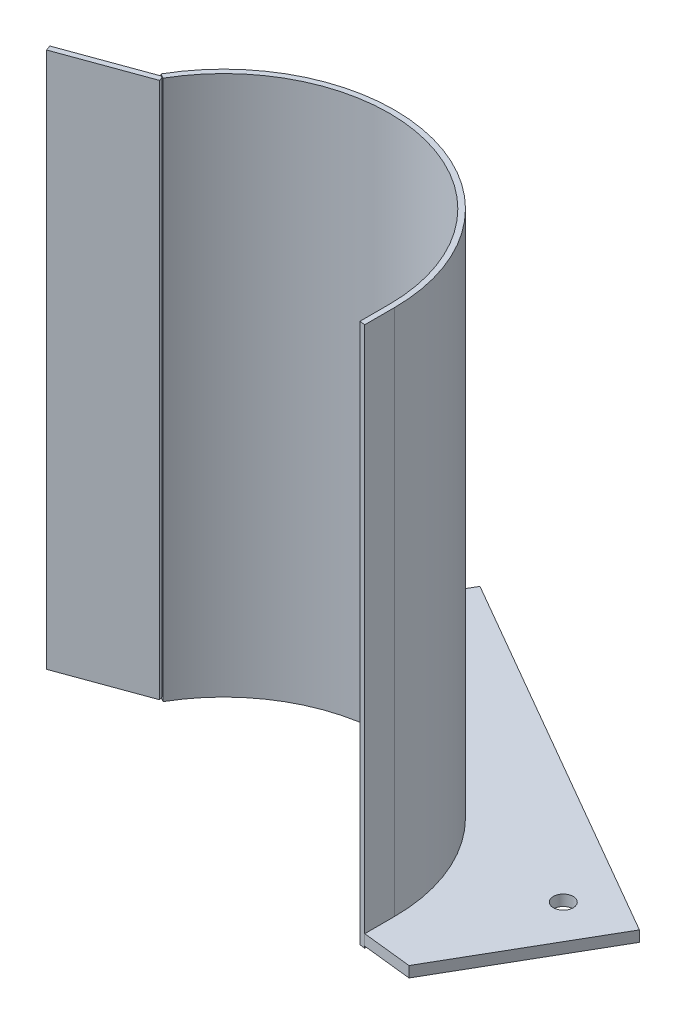
ISO-10303-21;
HEADER;
FILE_DESCRIPTION(('STEP AP214'),'2;1');
FILE_NAME('part.step','',(''),(''),'','','');
FILE_SCHEMA(('AUTOMOTIVE_DESIGN { 1 0 10303 214 1 1 1 1 }'));
ENDSEC;
DATA;
#1=APPLICATION_CONTEXT('core data for automotive mechanical design processes');
#2=APPLICATION_PROTOCOL_DEFINITION('international standard','automotive_design',2000,#1);
#3=PRODUCT_CONTEXT('',#1,'mechanical');
#4=PRODUCT('Part','Part','',(#3));
#5=PRODUCT_RELATED_PRODUCT_CATEGORY('part','',(#4));
#6=PRODUCT_DEFINITION_FORMATION('','',#4);
#7=PRODUCT_DEFINITION_CONTEXT('part definition',#1,'design');
#8=PRODUCT_DEFINITION('design','',#6,#7);
#9=PRODUCT_DEFINITION_SHAPE('','',#8);
#10=(LENGTH_UNIT() NAMED_UNIT(*) SI_UNIT(.MILLI.,.METRE.));
#11=(NAMED_UNIT(*) PLANE_ANGLE_UNIT() SI_UNIT($,.RADIAN.));
#12=(NAMED_UNIT(*) SI_UNIT($,.STERADIAN.) SOLID_ANGLE_UNIT());
#13=UNCERTAINTY_MEASURE_WITH_UNIT(LENGTH_MEASURE(1.E-05),#10,'distance_accuracy_value','');
#14=(GEOMETRIC_REPRESENTATION_CONTEXT(3) GLOBAL_UNCERTAINTY_ASSIGNED_CONTEXT((#13)) GLOBAL_UNIT_ASSIGNED_CONTEXT((#10,
#11,#12)) REPRESENTATION_CONTEXT('',''));
#15=CARTESIAN_POINT('',(0.,0.,0.));
#16=DIRECTION('',(0.,0.,1.));
#17=DIRECTION('',(1.,0.,0.));
#18=AXIS2_PLACEMENT_3D('',#15,#16,#17);
#19=CARTESIAN_POINT('',(-138.282661560574,-0.5,-14.0930838846632));
#20=DIRECTION('',(0.939692623772137,0.,-0.342020135121072));
#21=DIRECTION('',(-0.342020135121072,0.,-0.939692623772137));
#22=AXIS2_PLACEMENT_3D('',#19,#20,#21);
#23=PLANE('',#22);
#24=DIRECTION('',(0.,-1.,0.));
#25=VECTOR('',#24,1.);
#26=CARTESIAN_POINT('',(-138.795691763255,-0.5,-15.5026228203214));
#27=LINE('',#26,#25);
#28=CARTESIAN_POINT('',(-138.795691763255,148.500005930662,-15.5026228203214));
#29=VERTEX_POINT('',#28);
#30=CARTESIAN_POINT('',(-138.795691763255,-0.5,-15.5026228203214));
#31=VERTEX_POINT('',#30);
#32=EDGE_CURVE('E107',#29,#31,#27,.T.);
#33=ORIENTED_EDGE('',*,*,#32,.T.);
#34=DIRECTION('',(-0.342020135121072,0.,-0.939692623772137));
#35=VECTOR('',#34,1.);
#36=CARTESIAN_POINT('',(-138.282661560574,-0.5,-14.0930838846632));
#37=LINE('',#36,#35);
#38=CARTESIAN_POINT('',(-138.282661560574,-0.5,-14.0930838846632));
#39=VERTEX_POINT('',#38);
#40=EDGE_CURVE('E12',#39,#31,#37,.T.);
#41=ORIENTED_EDGE('',*,*,#40,.F.);
#42=DIRECTION('',(0.,-1.,0.));
#43=VECTOR('',#42,1.);
#44=CARTESIAN_POINT('',(-138.282661560574,-0.5,-14.0930838846632));
#45=LINE('',#44,#43);
#46=CARTESIAN_POINT('',(-138.282661560574,148.500005930662,-14.0930838846632));
#47=VERTEX_POINT('',#46);
#48=EDGE_CURVE('E95',#47,#39,#45,.T.);
#49=ORIENTED_EDGE('',*,*,#48,.F.);
#50=DIRECTION('',(-0.342020135121072,0.,-0.939692623772137));
#51=VECTOR('',#50,1.);
#52=CARTESIAN_POINT('',(-138.282661560574,148.500005930662,-14.0930838846632));
#53=LINE('',#52,#51);
#54=EDGE_CURVE('E103',#47,#29,#53,.T.);
#55=ORIENTED_EDGE('',*,*,#54,.T.);
#56=EDGE_LOOP('',(#33,#41,#49,#55));
#57=FACE_BOUND('',#56,.T.);
#58=ADVANCED_FACE('F44',(#57),#23,.F.);
#59=CARTESIAN_POINT('',(-138.282661560574,-0.5,-14.0930838846632));
#60=DIRECTION('',(0.,1.,0.));
#61=DIRECTION('',(0.,0.,1.));
#62=AXIS2_PLACEMENT_3D('',#59,#60,#61);
#63=PLANE('',#62);
#64=DIRECTION('',(0.939692623772137,0.,-0.342020135121072));
#65=VECTOR('',#64,1.);
#66=CARTESIAN_POINT('',(-138.795691763255,-0.5,-15.5026228203214));
#67=LINE('',#66,#65);
#68=CARTESIAN_POINT('',(-115.773222480838,-0.5,-23.8821161307877));
#69=VERTEX_POINT('',#68);
#70=EDGE_CURVE('E99',#31,#69,#67,.T.);
#71=ORIENTED_EDGE('',*,*,#70,.T.);
#72=DIRECTION('',(-0.342020135121072,0.,-0.939692623772137));
#73=VECTOR('',#72,1.);
#74=CARTESIAN_POINT('',(-115.260192278156,-0.5,-22.4725771951295));
#75=LINE('',#74,#73);
#76=CARTESIAN_POINT('',(-115.260192278156,-0.5,-22.4725771951295));
#77=VERTEX_POINT('',#76);
#78=EDGE_CURVE('E52',#77,#69,#75,.T.);
#79=ORIENTED_EDGE('',*,*,#78,.F.);
#80=DIRECTION('',(0.939692623772137,0.,-0.342020135121072));
#81=VECTOR('',#80,1.);
#82=CARTESIAN_POINT('',(-138.282661560574,-0.5,-14.0930838846632));
#83=LINE('',#82,#81);
#84=EDGE_CURVE('E90',#39,#77,#83,.T.);
#85=ORIENTED_EDGE('',*,*,#84,.F.);
#86=ORIENTED_EDGE('',*,*,#40,.T.);
#87=EDGE_LOOP('',(#71,#79,#85,#86));
#88=FACE_BOUND('',#87,.T.);
#89=ADVANCED_FACE('F98',(#88),#63,.F.);
#90=CARTESIAN_POINT('',(-115.260192278156,-0.5,-22.4725771951295));
#91=DIRECTION('',(-0.939692623772137,0.,0.342020135121072));
#92=DIRECTION('',(0.342020135121072,0.,0.939692623772137));
#93=AXIS2_PLACEMENT_3D('',#90,#91,#92);
#94=PLANE('',#93);
#95=DIRECTION('',(0.,1.,0.));
#96=VECTOR('',#95,1.);
#97=CARTESIAN_POINT('',(-115.773222480838,-0.5,-23.8821161307877));
#98=LINE('',#97,#96);
#99=CARTESIAN_POINT('',(-115.773222480838,148.500005930662,-23.8821161307877));
#100=VERTEX_POINT('',#99);
#101=EDGE_CURVE('E77',#69,#100,#98,.T.);
#102=ORIENTED_EDGE('',*,*,#101,.T.);
#103=DIRECTION('',(-0.342020135121072,0.,-0.939692623772137));
#104=VECTOR('',#103,1.);
#105=CARTESIAN_POINT('',(-115.260192278156,148.500005930662,-22.4725771951295));
#106=LINE('',#105,#104);
#107=CARTESIAN_POINT('',(-115.260192278156,148.500005930662,-22.4725771951295));
#108=VERTEX_POINT('',#107);
#109=EDGE_CURVE('E100',#108,#100,#106,.T.);
#110=ORIENTED_EDGE('',*,*,#109,.F.);
#111=DIRECTION('',(0.,1.,0.));
#112=VECTOR('',#111,1.);
#113=CARTESIAN_POINT('',(-115.260192278156,-0.5,-22.4725771951295));
#114=LINE('',#113,#112);
#115=EDGE_CURVE('E93',#77,#108,#114,.T.);
#116=ORIENTED_EDGE('',*,*,#115,.F.);
#117=ORIENTED_EDGE('',*,*,#78,.T.);
#118=EDGE_LOOP('',(#102,#110,#116,#117));
#119=FACE_BOUND('',#118,.T.);
#120=ADVANCED_FACE('F101',(#119),#94,.F.);
#121=CARTESIAN_POINT('',(-138.282661560574,148.500005930662,-14.0930838846632));
#122=DIRECTION('',(0.,-1.,0.));
#123=DIRECTION('',(0.,0.,-1.));
#124=AXIS2_PLACEMENT_3D('',#121,#122,#123);
#125=PLANE('',#124);
#126=DIRECTION('',(-0.939692623772137,0.,0.342020135121072));
#127=VECTOR('',#126,1.);
#128=CARTESIAN_POINT('',(-138.795691763255,148.500005930662,-15.5026228203214));
#129=LINE('',#128,#127);
#130=EDGE_CURVE('E83',#100,#29,#129,.T.);
#131=ORIENTED_EDGE('',*,*,#130,.T.);
#132=ORIENTED_EDGE('',*,*,#54,.F.);
#133=DIRECTION('',(-0.939692623772137,0.,0.342020135121072));
#134=VECTOR('',#133,1.);
#135=CARTESIAN_POINT('',(-138.282661560574,148.500005930662,-14.0930838846632));
#136=LINE('',#135,#134);
#137=EDGE_CURVE('E60',#108,#47,#136,.T.);
#138=ORIENTED_EDGE('',*,*,#137,.F.);
#139=ORIENTED_EDGE('',*,*,#109,.T.);
#140=EDGE_LOOP('',(#131,#132,#138,#139));
#141=FACE_BOUND('',#140,.T.);
#142=ADVANCED_FACE('F114',(#141),#125,.F.);
#143=CARTESIAN_POINT('',(-20.7054275275231,0.,-56.8876961374643));
#144=DIRECTION('',(-0.342020135121072,0.,-0.939692623772137));
#145=DIRECTION('',(-0.939692623772137,0.,0.342020135121072));
#146=AXIS2_PLACEMENT_3D('',#143,#144,#145);
#147=PLANE('',#146);
#148=ORIENTED_EDGE('',*,*,#48,.T.);
#149=ORIENTED_EDGE('',*,*,#84,.T.);
#150=ORIENTED_EDGE('',*,*,#115,.T.);
#151=ORIENTED_EDGE('',*,*,#137,.T.);
#152=EDGE_LOOP('',(#148,#149,#150,#151));
#153=FACE_BOUND('',#152,.T.);
#154=ADVANCED_FACE('F91',(#153),#147,.F.);
#155=CARTESIAN_POINT('',(-21.2184577302047,0.,-58.2972350731225));
#156=DIRECTION('',(-0.342020135121072,0.,-0.939692623772137));
#157=DIRECTION('',(-0.939692623772137,0.,0.342020135121072));
#158=AXIS2_PLACEMENT_3D('',#155,#156,#157);
#159=PLANE('',#158);
#160=ORIENTED_EDGE('',*,*,#32,.F.);
#161=ORIENTED_EDGE('',*,*,#130,.F.);
#162=ORIENTED_EDGE('',*,*,#101,.F.);
#163=ORIENTED_EDGE('',*,*,#70,.F.);
#164=EDGE_LOOP('',(#160,#161,#162,#163));
#165=FACE_BOUND('',#164,.T.);
#166=ADVANCED_FACE('F117',(#165),#159,.T.);
#167=CLOSED_SHELL('',(#58,#89,#120,#142,#154,#166));
#168=MANIFOLD_SOLID_BREP('B2',#167);
#169=CARTESIAN_POINT('',(-75.0000011175871,2.5,0.));
#170=DIRECTION('',(0.,1.,0.));
#171=DIRECTION('',(0.,0.,1.));
#172=AXIS2_PLACEMENT_3D('',#169,#170,#171);
#173=PLANE('',#172);
#174=CARTESIAN_POINT('',(-85.4711431702986,2.5,-71.863448015713));
#175=DIRECTION('',(0.,1.,0.));
#176=DIRECTION('',(0.,0.,1.));
#177=AXIS2_PLACEMENT_3D('',#174,#175,#176);
#178=CIRCLE('',#177,2.74999999999994);
#179=CARTESIAN_POINT('',(-85.4711431702986,2.5,-69.113448015713));
#180=VERTEX_POINT('',#179);
#181=EDGE_CURVE('E272',#180,#180,#178,.T.);
#182=ORIENTED_EDGE('',*,*,#181,.F.);
#183=EDGE_LOOP('',(#182));
#184=FACE_BOUND('',#183,.T.);
#185=DIRECTION('',(0.994060876940802,0.,0.108825424123615));
#186=VECTOR('',#185,1.);
#187=CARTESIAN_POINT('',(-27.5000011175871,2.5,8.31100029147373));
#188=LINE('',#187,#186);
#189=CARTESIAN_POINT('',(-27.5000011175871,2.5,8.31100029147373));
#190=VERTEX_POINT('',#189);
#191=CARTESIAN_POINT('',(-13.6980844911307,2.5,9.82197357835657));
#192=VERTEX_POINT('',#191);
#193=EDGE_CURVE('E281',#190,#192,#188,.T.);
#194=ORIENTED_EDGE('',*,*,#193,.T.);
#195=DIRECTION('',(0.5,0.,-0.866025403784439));
#196=VECTOR('',#195,1.);
#197=CARTESIAN_POINT('',(-13.6980844911307,2.5,9.82197357835657));
#198=LINE('',#197,#196);
#199=CARTESIAN_POINT('',(9.7294759487304,2.5,-30.7557514008736));
#200=VERTEX_POINT('',#199);
#201=EDGE_CURVE('E234',#192,#200,#198,.T.);
#202=ORIENTED_EDGE('',*,*,#201,.T.);
#203=DIRECTION('',(-0.866025403784439,0.,-0.5));
#204=VECTOR('',#203,1.);
#205=CARTESIAN_POINT('',(9.7294759487304,2.5,-30.7557514008736));
#206=LINE('',#205,#204);
#207=CARTESIAN_POINT('',(-95.0596007548729,2.5,-91.2557530438312));
#208=VERTEX_POINT('',#207);
#209=EDGE_CURVE('E293',#200,#208,#206,.T.);
#210=ORIENTED_EDGE('',*,*,#209,.T.);
#211=DIRECTION('',(-0.500000007561395,0.,0.866025399418865));
#212=VECTOR('',#211,1.);
#213=CARTESIAN_POINT('',(-138.795691763255,2.5,-15.5026228203214));
#214=LINE('',#213,#212);
#215=CARTESIAN_POINT('',(-138.795691763255,2.5,-15.5026228203214));
#216=VERTEX_POINT('',#215);
#217=EDGE_CURVE('E250',#208,#216,#214,.T.);
#218=ORIENTED_EDGE('',*,*,#217,.T.);
#219=DIRECTION('',(0.939692623772137,0.,-0.342020135121072));
#220=VECTOR('',#219,1.);
#221=CARTESIAN_POINT('',(-138.795691763255,2.5,-15.5026228203214));
#222=LINE('',#221,#220);
#223=CARTESIAN_POINT('',(-116.136207589983,2.5,-23.750000359166));
#224=VERTEX_POINT('',#223);
#225=EDGE_CURVE('E244',#216,#224,#222,.T.);
#226=ORIENTED_EDGE('',*,*,#225,.T.);
#227=CARTESIAN_POINT('',(-75.0000011175871,2.5,0.));
#228=DIRECTION('',(0.,-1.,0.));
#229=DIRECTION('',(0.,0.,1.));
#230=AXIS2_PLACEMENT_3D('',#227,#228,#229);
#231=CIRCLE('',#230,47.5);
#232=CARTESIAN_POINT('',(-27.5000011175871,2.5,0.));
#233=VERTEX_POINT('',#232);
#234=EDGE_CURVE('E248',#224,#233,#231,.T.);
#235=ORIENTED_EDGE('',*,*,#234,.T.);
#236=DIRECTION('',(0.,0.,1.));
#237=VECTOR('',#236,1.);
#238=CARTESIAN_POINT('',(-27.5000011175871,2.5,8.31100029147373));
#239=LINE('',#238,#237);
#240=EDGE_CURVE('E194',#233,#190,#239,.T.);
#241=ORIENTED_EDGE('',*,*,#240,.T.);
#242=EDGE_LOOP('',(#194,#202,#210,#218,#226,#235,#241));
#243=FACE_BOUND('',#242,.T.);
#244=CARTESIAN_POINT('',(-7.52885682969917,2.5,-26.863448015713));
#245=DIRECTION('',(0.,1.,0.));
#246=DIRECTION('',(0.,0.,1.));
#247=AXIS2_PLACEMENT_3D('',#244,#245,#246);
#248=CIRCLE('',#247,2.75000000000001);
#249=CARTESIAN_POINT('',(-7.52885682969917,2.5,-24.113448015713));
#250=VERTEX_POINT('',#249);
#251=EDGE_CURVE('E308',#250,#250,#248,.T.);
#252=ORIENTED_EDGE('',*,*,#251,.F.);
#253=EDGE_LOOP('',(#252));
#254=FACE_BOUND('',#253,.T.);
#255=ADVANCED_FACE('F177',(#184,#243,#254),#173,.T.);
#256=CARTESIAN_POINT('',(-75.0000011175871,-0.5,0.));
#257=DIRECTION('',(0.,1.,0.));
#258=DIRECTION('',(0.,0.,1.));
#259=AXIS2_PLACEMENT_3D('',#256,#257,#258);
#260=PLANE('',#259);
#261=DIRECTION('',(0.994060876940802,0.,0.108825424123615));
#262=VECTOR('',#261,1.);
#263=CARTESIAN_POINT('',(-27.5000011175871,-0.5,8.31100029147373));
#264=LINE('',#263,#262);
#265=CARTESIAN_POINT('',(-27.5000011175871,-0.5,8.31100029147373));
#266=VERTEX_POINT('',#265);
#267=CARTESIAN_POINT('',(-13.6980844911307,-0.5,9.82197357835657));
#268=VERTEX_POINT('',#267);
#269=EDGE_CURVE('E268',#266,#268,#264,.T.);
#270=ORIENTED_EDGE('',*,*,#269,.F.);
#271=DIRECTION('',(0.,0.,1.));
#272=VECTOR('',#271,1.);
#273=CARTESIAN_POINT('',(-27.5000011175871,-0.5,8.31100029147373));
#274=LINE('',#273,#272);
#275=CARTESIAN_POINT('',(-27.5000011175871,-0.5,0.));
#276=VERTEX_POINT('',#275);
#277=EDGE_CURVE('E226',#276,#266,#274,.T.);
#278=ORIENTED_EDGE('',*,*,#277,.F.);
#279=CARTESIAN_POINT('',(-75.0000011175871,-0.5,0.));
#280=DIRECTION('',(0.,-1.,0.));
#281=DIRECTION('',(0.,0.,1.));
#282=AXIS2_PLACEMENT_3D('',#279,#280,#281);
#283=CIRCLE('',#282,47.5);
#284=CARTESIAN_POINT('',(-116.136207589983,-0.5,-23.750000359166));
#285=VERTEX_POINT('',#284);
#286=EDGE_CURVE('E220',#285,#276,#283,.T.);
#287=ORIENTED_EDGE('',*,*,#286,.F.);
#288=DIRECTION('',(0.939692623772137,0.,-0.342020135121072));
#289=VECTOR('',#288,1.);
#290=CARTESIAN_POINT('',(-138.795691763255,-0.5,-15.5026228203214));
#291=LINE('',#290,#289);
#292=CARTESIAN_POINT('',(-138.795691763255,-0.5,-15.5026228203214));
#293=VERTEX_POINT('',#292);
#294=EDGE_CURVE('E258',#293,#285,#291,.T.);
#295=ORIENTED_EDGE('',*,*,#294,.F.);
#296=DIRECTION('',(-0.500000007561395,0.,0.866025399418865));
#297=VECTOR('',#296,1.);
#298=CARTESIAN_POINT('',(-138.795691763255,-0.5,-15.5026228203214));
#299=LINE('',#298,#297);
#300=CARTESIAN_POINT('',(-95.0596007548729,-0.5,-91.2557530438312));
#301=VERTEX_POINT('',#300);
#302=EDGE_CURVE('E276',#301,#293,#299,.T.);
#303=ORIENTED_EDGE('',*,*,#302,.F.);
#304=DIRECTION('',(-0.866025403784439,0.,-0.5));
#305=VECTOR('',#304,1.);
#306=CARTESIAN_POINT('',(9.7294759487304,-0.5,-30.7557514008736));
#307=LINE('',#306,#305);
#308=CARTESIAN_POINT('',(9.7294759487304,-0.5,-30.7557514008736));
#309=VERTEX_POINT('',#308);
#310=EDGE_CURVE('E274',#309,#301,#307,.T.);
#311=ORIENTED_EDGE('',*,*,#310,.F.);
#312=DIRECTION('',(0.5,0.,-0.866025403784439));
#313=VECTOR('',#312,1.);
#314=CARTESIAN_POINT('',(-13.6980844911307,-0.5,9.82197357835657));
#315=LINE('',#314,#313);
#316=EDGE_CURVE('E271',#268,#309,#315,.T.);
#317=ORIENTED_EDGE('',*,*,#316,.F.);
#318=EDGE_LOOP('',(#270,#278,#287,#295,#303,#311,#317));
#319=FACE_BOUND('',#318,.T.);
#320=CARTESIAN_POINT('',(-85.4711431702986,-0.5,-71.863448015713));
#321=DIRECTION('',(0.,1.,0.));
#322=DIRECTION('',(0.,0.,1.));
#323=AXIS2_PLACEMENT_3D('',#320,#321,#322);
#324=CIRCLE('',#323,2.74999999999994);
#325=CARTESIAN_POINT('',(-85.4711431702986,-0.5,-69.113448015713));
#326=VERTEX_POINT('',#325);
#327=EDGE_CURVE('E305',#326,#326,#324,.T.);
#328=ORIENTED_EDGE('',*,*,#327,.T.);
#329=EDGE_LOOP('',(#328));
#330=FACE_BOUND('',#329,.T.);
#331=CARTESIAN_POINT('',(-7.52885682969917,-0.5,-26.863448015713));
#332=DIRECTION('',(0.,1.,0.));
#333=DIRECTION('',(0.,0.,1.));
#334=AXIS2_PLACEMENT_3D('',#331,#332,#333);
#335=CIRCLE('',#334,2.75000000000001);
#336=CARTESIAN_POINT('',(-7.52885682969917,-0.5,-24.113448015713));
#337=VERTEX_POINT('',#336);
#338=EDGE_CURVE('E311',#337,#337,#335,.T.);
#339=ORIENTED_EDGE('',*,*,#338,.T.);
#340=EDGE_LOOP('',(#339));
#341=FACE_BOUND('',#340,.T.);
#342=ADVANCED_FACE('F297',(#319,#330,#341),#260,.F.);
#343=CARTESIAN_POINT('',(-27.5000011175871,2.5,8.31100029147373));
#344=DIRECTION('',(0.108825424123615,0.,-0.994060876940801));
#345=DIRECTION('',(-0.994060876940802,0.,-0.108825424123615));
#346=AXIS2_PLACEMENT_3D('',#343,#344,#345);
#347=PLANE('',#346);
#348=ORIENTED_EDGE('',*,*,#269,.T.);
#349=DIRECTION('',(0.,-1.,0.));
#350=VECTOR('',#349,1.);
#351=CARTESIAN_POINT('',(-13.6980844911307,2.5,9.82197357835657));
#352=LINE('',#351,#350);
#353=EDGE_CURVE('E42',#192,#268,#352,.T.);
#354=ORIENTED_EDGE('',*,*,#353,.F.);
#355=ORIENTED_EDGE('',*,*,#193,.F.);
#356=DIRECTION('',(0.,-1.,0.));
#357=VECTOR('',#356,1.);
#358=CARTESIAN_POINT('',(-27.5000011175871,2.5,8.31100029147373));
#359=LINE('',#358,#357);
#360=EDGE_CURVE('E264',#190,#266,#359,.T.);
#361=ORIENTED_EDGE('',*,*,#360,.T.);
#362=EDGE_LOOP('',(#348,#354,#355,#361));
#363=FACE_BOUND('',#362,.T.);
#364=ADVANCED_FACE('F179',(#363),#347,.F.);
#365=CARTESIAN_POINT('',(-13.6980844911307,2.5,9.82197357835657));
#366=DIRECTION('',(-0.866025403784439,0.,-0.5));
#367=DIRECTION('',(-0.5,0.,0.866025403784439));
#368=AXIS2_PLACEMENT_3D('',#365,#366,#367);
#369=PLANE('',#368);
#370=ORIENTED_EDGE('',*,*,#316,.T.);
#371=DIRECTION('',(0.,-1.,0.));
#372=VECTOR('',#371,1.);
#373=CARTESIAN_POINT('',(9.7294759487304,2.5,-30.7557514008736));
#374=LINE('',#373,#372);
#375=EDGE_CURVE('E186',#200,#309,#374,.T.);
#376=ORIENTED_EDGE('',*,*,#375,.F.);
#377=ORIENTED_EDGE('',*,*,#201,.F.);
#378=ORIENTED_EDGE('',*,*,#353,.T.);
#379=EDGE_LOOP('',(#370,#376,#377,#378));
#380=FACE_BOUND('',#379,.T.);
#381=ADVANCED_FACE('F341',(#380),#369,.F.);
#382=CARTESIAN_POINT('',(9.7294759487304,2.5,-30.7557514008736));
#383=DIRECTION('',(-0.5,0.,0.866025403784439));
#384=DIRECTION('',(0.866025403784439,0.,0.5));
#385=AXIS2_PLACEMENT_3D('',#382,#383,#384);
#386=PLANE('',#385);
#387=ORIENTED_EDGE('',*,*,#310,.T.);
#388=DIRECTION('',(0.,-1.,0.));
#389=VECTOR('',#388,1.);
#390=CARTESIAN_POINT('',(-95.0596007548729,2.5,-91.2557530438312));
#391=LINE('',#390,#389);
#392=EDGE_CURVE('E285',#208,#301,#391,.T.);
#393=ORIENTED_EDGE('',*,*,#392,.F.);
#394=ORIENTED_EDGE('',*,*,#209,.F.);
#395=ORIENTED_EDGE('',*,*,#375,.T.);
#396=EDGE_LOOP('',(#387,#393,#394,#395));
#397=FACE_BOUND('',#396,.T.);
#398=ADVANCED_FACE('F291',(#397),#386,.F.);
#399=CARTESIAN_POINT('',(-138.795691763255,2.5,-15.5026228203214));
#400=DIRECTION('',(0.866025399418865,0.,0.500000007561395));
#401=DIRECTION('',(0.500000007561396,0.,-0.866025399418865));
#402=AXIS2_PLACEMENT_3D('',#399,#400,#401);
#403=PLANE('',#402);
#404=ORIENTED_EDGE('',*,*,#302,.T.);
#405=DIRECTION('',(0.,-1.,0.));
#406=VECTOR('',#405,1.);
#407=CARTESIAN_POINT('',(-138.795691763255,2.5,-15.5026228203214));
#408=LINE('',#407,#406);
#409=EDGE_CURVE('E259',#216,#293,#408,.T.);
#410=ORIENTED_EDGE('',*,*,#409,.F.);
#411=ORIENTED_EDGE('',*,*,#217,.F.);
#412=ORIENTED_EDGE('',*,*,#392,.T.);
#413=EDGE_LOOP('',(#404,#410,#411,#412));
#414=FACE_BOUND('',#413,.T.);
#415=ADVANCED_FACE('F300',(#414),#403,.F.);
#416=CARTESIAN_POINT('',(-138.795691763255,2.5,-15.5026228203214));
#417=DIRECTION('',(-0.342020135121072,0.,-0.939692623772137));
#418=DIRECTION('',(-0.939692623772137,0.,0.342020135121072));
#419=AXIS2_PLACEMENT_3D('',#416,#417,#418);
#420=PLANE('',#419);
#421=ORIENTED_EDGE('',*,*,#294,.T.);
#422=DIRECTION('',(0.,-1.,0.));
#423=VECTOR('',#422,1.);
#424=CARTESIAN_POINT('',(-116.136207589983,2.5,-23.750000359166));
#425=LINE('',#424,#423);
#426=EDGE_CURVE('E255',#224,#285,#425,.T.);
#427=ORIENTED_EDGE('',*,*,#426,.F.);
#428=ORIENTED_EDGE('',*,*,#225,.F.);
#429=ORIENTED_EDGE('',*,*,#409,.T.);
#430=EDGE_LOOP('',(#421,#427,#428,#429));
#431=FACE_BOUND('',#430,.T.);
#432=ADVANCED_FACE('F256',(#431),#420,.F.);
#433=CARTESIAN_POINT('',(-75.0000011175871,2.5,0.));
#434=DIRECTION('',(0.,-1.,0.));
#435=DIRECTION('',(0.,0.,-1.));
#436=AXIS2_PLACEMENT_3D('',#433,#434,#435);
#437=CYLINDRICAL_SURFACE('',#436,47.5);
#438=ORIENTED_EDGE('',*,*,#286,.T.);
#439=DIRECTION('',(0.,-1.,0.));
#440=VECTOR('',#439,1.);
#441=CARTESIAN_POINT('',(-27.5000011175871,2.5,0.));
#442=LINE('',#441,#440);
#443=EDGE_CURVE('E260',#233,#276,#442,.T.);
#444=ORIENTED_EDGE('',*,*,#443,.F.);
#445=ORIENTED_EDGE('',*,*,#234,.F.);
#446=ORIENTED_EDGE('',*,*,#426,.T.);
#447=EDGE_LOOP('',(#438,#444,#445,#446));
#448=FACE_BOUND('',#447,.T.);
#449=ADVANCED_FACE('F262',(#448),#437,.F.);
#450=CARTESIAN_POINT('',(-27.5000011175871,2.5,8.31100029147373));
#451=DIRECTION('',(1.,0.,0.));
#452=DIRECTION('',(0.,0.,-1.));
#453=AXIS2_PLACEMENT_3D('',#450,#451,#452);
#454=PLANE('',#453);
#455=ORIENTED_EDGE('',*,*,#277,.T.);
#456=ORIENTED_EDGE('',*,*,#360,.F.);
#457=ORIENTED_EDGE('',*,*,#240,.F.);
#458=ORIENTED_EDGE('',*,*,#443,.T.);
#459=EDGE_LOOP('',(#455,#456,#457,#458));
#460=FACE_BOUND('',#459,.T.);
#461=ADVANCED_FACE('F331',(#460),#454,.F.);
#462=CARTESIAN_POINT('',(-85.4711431702986,2.5,-71.863448015713));
#463=DIRECTION('',(0.,-1.,0.));
#464=DIRECTION('',(0.,0.,-1.));
#465=AXIS2_PLACEMENT_3D('',#462,#463,#464);
#466=CYLINDRICAL_SURFACE('',#465,2.74999999999994);
#467=ORIENTED_EDGE('',*,*,#181,.T.);
#468=EDGE_LOOP('',(#467));
#469=FACE_BOUND('',#468,.T.);
#470=ORIENTED_EDGE('',*,*,#327,.F.);
#471=EDGE_LOOP('',(#470));
#472=FACE_BOUND('',#471,.T.);
#473=ADVANCED_FACE('F328',(#469,#472),#466,.F.);
#474=CARTESIAN_POINT('',(-7.52885682969917,2.5,-26.863448015713));
#475=DIRECTION('',(0.,-1.,0.));
#476=DIRECTION('',(0.,0.,-1.));
#477=AXIS2_PLACEMENT_3D('',#474,#475,#476);
#478=CYLINDRICAL_SURFACE('',#477,2.75000000000001);
#479=ORIENTED_EDGE('',*,*,#251,.T.);
#480=EDGE_LOOP('',(#479));
#481=FACE_BOUND('',#480,.T.);
#482=ORIENTED_EDGE('',*,*,#338,.F.);
#483=EDGE_LOOP('',(#482));
#484=FACE_BOUND('',#483,.T.);
#485=ADVANCED_FACE('F317',(#481,#484),#478,.F.);
#486=CLOSED_SHELL('',(#255,#342,#364,#381,#398,#415,#432,#449,#461,#473,#485));
#487=MANIFOLD_SOLID_BREP('B6',#486);
#488=CARTESIAN_POINT('',(-75.0000011175871,149.000002965331,0.));
#489=DIRECTION('',(0.,-1.,0.));
#490=DIRECTION('',(0.,0.,-1.));
#491=AXIS2_PLACEMENT_3D('',#488,#489,#490);
#492=CYLINDRICAL_SURFACE('',#491,47.5);
#493=CARTESIAN_POINT('',(-75.0000011175871,-0.999997034668867,0.));
#494=DIRECTION('',(0.,1.,0.));
#495=DIRECTION('',(0.,0.,1.));
#496=AXIS2_PLACEMENT_3D('',#493,#494,#495);
#497=CIRCLE('',#496,47.5);
#498=CARTESIAN_POINT('',(-27.5000011175871,-0.999997034668867,0.));
#499=VERTEX_POINT('',#498);
#500=CARTESIAN_POINT('',(-116.136207589983,-0.999997034668867,-23.750000359166));
#501=VERTEX_POINT('',#500);
#502=EDGE_CURVE('E505',#499,#501,#497,.T.);
#503=ORIENTED_EDGE('',*,*,#502,.T.);
#504=DIRECTION('',(0.,-1.,0.));
#505=VECTOR('',#504,1.);
#506=CARTESIAN_POINT('',(-116.136207589983,149.000002965331,-23.750000359166));
#507=LINE('',#506,#505);
#508=CARTESIAN_POINT('',(-116.136207589983,149.000002965331,-23.750000359166));
#509=VERTEX_POINT('',#508);
#510=EDGE_CURVE('E175',#509,#501,#507,.T.);
#511=ORIENTED_EDGE('',*,*,#510,.F.);
#512=CARTESIAN_POINT('',(-75.0000011175871,149.000002965331,0.));
#513=DIRECTION('',(0.,1.,0.));
#514=DIRECTION('',(0.,0.,1.));
#515=AXIS2_PLACEMENT_3D('',#512,#513,#514);
#516=CIRCLE('',#515,47.5);
#517=CARTESIAN_POINT('',(-27.5000011175871,149.000002965331,0.));
#518=VERTEX_POINT('',#517);
#519=EDGE_CURVE('E515',#518,#509,#516,.T.);
#520=ORIENTED_EDGE('',*,*,#519,.F.);
#521=DIRECTION('',(0.,-1.,0.));
#522=VECTOR('',#521,1.);
#523=CARTESIAN_POINT('',(-27.5000011175871,149.000002965331,0.));
#524=LINE('',#523,#522);
#525=EDGE_CURVE('E501',#518,#499,#524,.T.);
#526=ORIENTED_EDGE('',*,*,#525,.T.);
#527=EDGE_LOOP('',(#503,#511,#520,#526));
#528=FACE_BOUND('',#527,.T.);
#529=ADVANCED_FACE('F421',(#528),#492,.T.);
#530=CARTESIAN_POINT('',(-116.136207589983,149.000002965331,-23.750000359166));
#531=DIRECTION('',(0.500000007561404,0.,-0.86602539941886));
#532=DIRECTION('',(-0.86602539941886,0.,-0.500000007561404));
#533=AXIS2_PLACEMENT_3D('',#530,#531,#532);
#534=PLANE('',#533);
#535=DIRECTION('',(0.86602539941886,0.,0.500000007561404));
#536=VECTOR('',#535,1.);
#537=CARTESIAN_POINT('',(-116.136207589983,-0.999997034668867,-23.750000359166));
#538=LINE('',#537,#536);
#539=CARTESIAN_POINT('',(-114.837169490855,-0.999997034668867,-23.000000347824));
#540=VERTEX_POINT('',#539);
#541=EDGE_CURVE('E508',#501,#540,#538,.T.);
#542=ORIENTED_EDGE('',*,*,#541,.T.);
#543=DIRECTION('',(0.,-1.,0.));
#544=VECTOR('',#543,1.);
#545=CARTESIAN_POINT('',(-114.837169490855,149.000002965331,-23.000000347824));
#546=LINE('',#545,#544);
#547=CARTESIAN_POINT('',(-114.837169490855,149.000002965331,-23.000000347824));
#548=VERTEX_POINT('',#547);
#549=EDGE_CURVE('E429',#548,#540,#546,.T.);
#550=ORIENTED_EDGE('',*,*,#549,.F.);
#551=DIRECTION('',(0.86602539941886,0.,0.500000007561404));
#552=VECTOR('',#551,1.);
#553=CARTESIAN_POINT('',(-116.136207589983,149.000002965331,-23.750000359166));
#554=LINE('',#553,#552);
#555=EDGE_CURVE('E474',#509,#548,#554,.T.);
#556=ORIENTED_EDGE('',*,*,#555,.F.);
#557=ORIENTED_EDGE('',*,*,#510,.T.);
#558=EDGE_LOOP('',(#542,#550,#556,#557));
#559=FACE_BOUND('',#558,.T.);
#560=ADVANCED_FACE('F539',(#559),#534,.F.);
#561=CARTESIAN_POINT('',(-75.0000011175871,149.000002965331,0.));
#562=DIRECTION('',(0.,-1.,0.));
#563=DIRECTION('',(0.,0.,-1.));
#564=AXIS2_PLACEMENT_3D('',#561,#562,#563);
#565=CYLINDRICAL_SURFACE('',#564,46.);
#566=CARTESIAN_POINT('',(-75.0000011175871,-0.999997034668867,0.));
#567=DIRECTION('',(0.,-1.,0.));
#568=DIRECTION('',(0.,0.,1.));
#569=AXIS2_PLACEMENT_3D('',#566,#567,#568);
#570=CIRCLE('',#569,46.);
#571=CARTESIAN_POINT('',(-29.0000011175871,-0.999997034668867,0.));
#572=VERTEX_POINT('',#571);
#573=EDGE_CURVE('E510',#540,#572,#570,.T.);
#574=ORIENTED_EDGE('',*,*,#573,.T.);
#575=DIRECTION('',(0.,-1.,0.));
#576=VECTOR('',#575,1.);
#577=CARTESIAN_POINT('',(-29.0000011175871,149.000002965331,0.));
#578=LINE('',#577,#576);
#579=CARTESIAN_POINT('',(-29.0000011175871,149.000002965331,0.));
#580=VERTEX_POINT('',#579);
#581=EDGE_CURVE('E496',#580,#572,#578,.T.);
#582=ORIENTED_EDGE('',*,*,#581,.F.);
#583=CARTESIAN_POINT('',(-75.0000011175871,149.000002965331,0.));
#584=DIRECTION('',(0.,-1.,0.));
#585=DIRECTION('',(0.,0.,1.));
#586=AXIS2_PLACEMENT_3D('',#583,#584,#585);
#587=CIRCLE('',#586,46.);
#588=EDGE_CURVE('E487',#548,#580,#587,.T.);
#589=ORIENTED_EDGE('',*,*,#588,.F.);
#590=ORIENTED_EDGE('',*,*,#549,.T.);
#591=EDGE_LOOP('',(#574,#582,#589,#590));
#592=FACE_BOUND('',#591,.T.);
#593=ADVANCED_FACE('F521',(#592),#565,.F.);
#594=CARTESIAN_POINT('',(-29.0000011175871,149.000002965331,0.));
#595=DIRECTION('',(1.,0.,0.));
#596=DIRECTION('',(0.,0.,-1.));
#597=AXIS2_PLACEMENT_3D('',#594,#595,#596);
#598=PLANE('',#597);
#599=DIRECTION('',(0.,0.,1.));
#600=VECTOR('',#599,1.);
#601=CARTESIAN_POINT('',(-29.0000011175871,-0.999997034668867,0.));
#602=LINE('',#601,#600);
#603=CARTESIAN_POINT('',(-29.0000011175871,-0.999997034668867,8.14678687157958));
#604=VERTEX_POINT('',#603);
#605=EDGE_CURVE('E495',#572,#604,#602,.T.);
#606=ORIENTED_EDGE('',*,*,#605,.T.);
#607=DIRECTION('',(0.,-1.,0.));
#608=VECTOR('',#607,1.);
#609=CARTESIAN_POINT('',(-29.0000011175871,149.000002965331,8.14678687157958));
#610=LINE('',#609,#608);
#611=CARTESIAN_POINT('',(-29.0000011175871,149.000002965331,8.14678687157958));
#612=VERTEX_POINT('',#611);
#613=EDGE_CURVE('E492',#612,#604,#610,.T.);
#614=ORIENTED_EDGE('',*,*,#613,.F.);
#615=DIRECTION('',(0.,0.,1.));
#616=VECTOR('',#615,1.);
#617=CARTESIAN_POINT('',(-29.0000011175871,149.000002965331,0.));
#618=LINE('',#617,#616);
#619=EDGE_CURVE('E481',#580,#612,#618,.T.);
#620=ORIENTED_EDGE('',*,*,#619,.F.);
#621=ORIENTED_EDGE('',*,*,#581,.T.);
#622=EDGE_LOOP('',(#606,#614,#620,#621));
#623=FACE_BOUND('',#622,.T.);
#624=ADVANCED_FACE('F493',(#623),#598,.F.);
#625=CARTESIAN_POINT('',(-29.0000011175871,149.000002965331,8.14678687157958));
#626=DIRECTION('',(0.108825424123616,0.,-0.994060876940801));
#627=DIRECTION('',(-0.994060876940801,0.,-0.108825424123616));
#628=AXIS2_PLACEMENT_3D('',#625,#626,#627);
#629=PLANE('',#628);
#630=DIRECTION('',(0.994060876940802,0.,0.108825424123616));
#631=VECTOR('',#630,1.);
#632=CARTESIAN_POINT('',(-29.0000011175871,-0.999997034668867,8.14678687157958));
#633=LINE('',#632,#631);
#634=CARTESIAN_POINT('',(-27.5000011175871,-0.999997034668867,8.31100029147373));
#635=VERTEX_POINT('',#634);
#636=EDGE_CURVE('E460',#604,#635,#633,.T.);
#637=ORIENTED_EDGE('',*,*,#636,.T.);
#638=DIRECTION('',(0.,-1.,0.));
#639=VECTOR('',#638,1.);
#640=CARTESIAN_POINT('',(-27.5000011175871,149.000002965331,8.31100029147373));
#641=LINE('',#640,#639);
#642=CARTESIAN_POINT('',(-27.5000011175871,149.000002965331,8.31100029147373));
#643=VERTEX_POINT('',#642);
#644=EDGE_CURVE('E497',#643,#635,#641,.T.);
#645=ORIENTED_EDGE('',*,*,#644,.F.);
#646=DIRECTION('',(0.994060876940802,0.,0.108825424123616));
#647=VECTOR('',#646,1.);
#648=CARTESIAN_POINT('',(-29.0000011175871,149.000002965331,8.14678687157958));
#649=LINE('',#648,#647);
#650=EDGE_CURVE('E485',#612,#643,#649,.T.);
#651=ORIENTED_EDGE('',*,*,#650,.F.);
#652=ORIENTED_EDGE('',*,*,#613,.T.);
#653=EDGE_LOOP('',(#637,#645,#651,#652));
#654=FACE_BOUND('',#653,.T.);
#655=ADVANCED_FACE('F499',(#654),#629,.F.);
#656=CARTESIAN_POINT('',(-27.5000011175871,149.000002965331,8.31100029147373));
#657=DIRECTION('',(-1.,0.,0.));
#658=DIRECTION('',(0.,0.,1.));
#659=AXIS2_PLACEMENT_3D('',#656,#657,#658);
#660=PLANE('',#659);
#661=DIRECTION('',(0.,0.,-1.));
#662=VECTOR('',#661,1.);
#663=CARTESIAN_POINT('',(-27.5000011175871,-0.999997034668867,8.31100029147373));
#664=LINE('',#663,#662);
#665=EDGE_CURVE('E466',#635,#499,#664,.T.);
#666=ORIENTED_EDGE('',*,*,#665,.T.);
#667=ORIENTED_EDGE('',*,*,#525,.F.);
#668=DIRECTION('',(0.,0.,-1.));
#669=VECTOR('',#668,1.);
#670=CARTESIAN_POINT('',(-27.5000011175871,149.000002965331,8.31100029147373));
#671=LINE('',#670,#669);
#672=EDGE_CURVE('E437',#643,#518,#671,.T.);
#673=ORIENTED_EDGE('',*,*,#672,.F.);
#674=ORIENTED_EDGE('',*,*,#644,.T.);
#675=EDGE_LOOP('',(#666,#667,#673,#674));
#676=FACE_BOUND('',#675,.T.);
#677=ADVANCED_FACE('F528',(#676),#660,.F.);
#678=CARTESIAN_POINT('',(-75.0000011175871,149.000002965331,0.));
#679=DIRECTION('',(0.,1.,0.));
#680=DIRECTION('',(0.,0.,1.));
#681=AXIS2_PLACEMENT_3D('',#678,#679,#680);
#682=PLANE('',#681);
#683=ORIENTED_EDGE('',*,*,#519,.T.);
#684=ORIENTED_EDGE('',*,*,#555,.T.);
#685=ORIENTED_EDGE('',*,*,#588,.T.);
#686=ORIENTED_EDGE('',*,*,#619,.T.);
#687=ORIENTED_EDGE('',*,*,#650,.T.);
#688=ORIENTED_EDGE('',*,*,#672,.T.);
#689=EDGE_LOOP('',(#683,#684,#685,#686,#687,#688));
#690=FACE_BOUND('',#689,.T.);
#691=ADVANCED_FACE('F483',(#690),#682,.T.);
#692=CARTESIAN_POINT('',(-75.0000011175871,-0.999997034668867,0.));
#693=DIRECTION('',(0.,1.,0.));
#694=DIRECTION('',(0.,0.,1.));
#695=AXIS2_PLACEMENT_3D('',#692,#693,#694);
#696=PLANE('',#695);
#697=ORIENTED_EDGE('',*,*,#502,.F.);
#698=ORIENTED_EDGE('',*,*,#665,.F.);
#699=ORIENTED_EDGE('',*,*,#636,.F.);
#700=ORIENTED_EDGE('',*,*,#605,.F.);
#701=ORIENTED_EDGE('',*,*,#573,.F.);
#702=ORIENTED_EDGE('',*,*,#541,.F.);
#703=EDGE_LOOP('',(#697,#698,#699,#700,#701,#702));
#704=FACE_BOUND('',#703,.T.);
#705=ADVANCED_FACE('F524',(#704),#696,.F.);
#706=CLOSED_SHELL('',(#529,#560,#593,#624,#655,#677,#691,#705));
#707=MANIFOLD_SOLID_BREP('B36',#706);
#708=ADVANCED_BREP_SHAPE_REPRESENTATION('',(#18,#168,#487,#707),#14);
#709=SHAPE_DEFINITION_REPRESENTATION(#9,#708);
ENDSEC;
END-ISO-10303-21;
